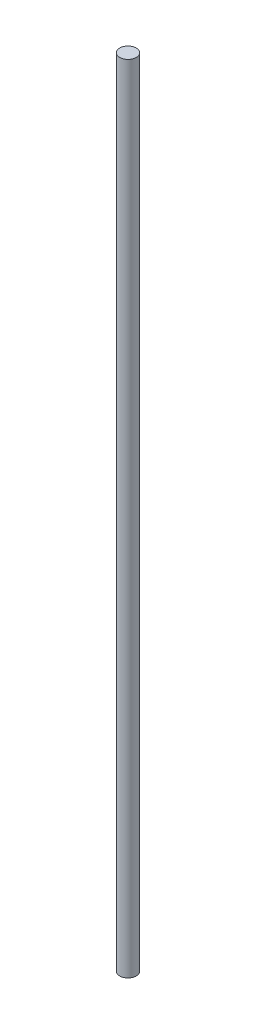
ISO-10303-21;
HEADER;
FILE_DESCRIPTION(('STEP AP214'),'2;1');
FILE_NAME('part.step','',(''),(''),'','','');
FILE_SCHEMA(('AUTOMOTIVE_DESIGN { 1 0 10303 214 1 1 1 1 }'));
ENDSEC;
DATA;
#1=APPLICATION_CONTEXT('core data for automotive mechanical design processes');
#2=APPLICATION_PROTOCOL_DEFINITION('international standard','automotive_design',2000,#1);
#3=PRODUCT_CONTEXT('',#1,'mechanical');
#4=PRODUCT('Part','Part','',(#3));
#5=PRODUCT_RELATED_PRODUCT_CATEGORY('part','',(#4));
#6=PRODUCT_DEFINITION_FORMATION('','',#4);
#7=PRODUCT_DEFINITION_CONTEXT('part definition',#1,'design');
#8=PRODUCT_DEFINITION('design','',#6,#7);
#9=PRODUCT_DEFINITION_SHAPE('','',#8);
#10=(LENGTH_UNIT() NAMED_UNIT(*) SI_UNIT(.MILLI.,.METRE.));
#11=(NAMED_UNIT(*) PLANE_ANGLE_UNIT() SI_UNIT($,.RADIAN.));
#12=(NAMED_UNIT(*) SI_UNIT($,.STERADIAN.) SOLID_ANGLE_UNIT());
#13=UNCERTAINTY_MEASURE_WITH_UNIT(LENGTH_MEASURE(1.E-05),#10,'distance_accuracy_value','');
#14=(GEOMETRIC_REPRESENTATION_CONTEXT(3) GLOBAL_UNCERTAINTY_ASSIGNED_CONTEXT((#13)) GLOBAL_UNIT_ASSIGNED_CONTEXT((#10,
#11,#12)) REPRESENTATION_CONTEXT('',''));
#15=CARTESIAN_POINT('',(0.,0.,0.));
#16=DIRECTION('',(0.,0.,1.));
#17=DIRECTION('',(1.,0.,0.));
#18=AXIS2_PLACEMENT_3D('',#15,#16,#17);
#19=CARTESIAN_POINT('',(-8.5683409021784,386.5,-5.41821557049514));
#20=DIRECTION('',(0.,-1.,0.));
#21=DIRECTION('',(0.,0.,-1.));
#22=AXIS2_PLACEMENT_3D('',#19,#20,#21);
#23=CYLINDRICAL_SURFACE('',#22,4.);
#24=CARTESIAN_POINT('',(-8.5683409021784,386.5,-5.41821557049514));
#25=DIRECTION('',(0.,1.,0.));
#26=DIRECTION('',(0.,0.,1.));
#27=AXIS2_PLACEMENT_3D('',#24,#25,#26);
#28=CIRCLE('',#27,4.);
#29=CARTESIAN_POINT('',(-8.5683409021784,386.5,-1.41821557049514));
#30=VERTEX_POINT('',#29);
#31=EDGE_CURVE('E10',#30,#30,#28,.T.);
#32=ORIENTED_EDGE('',*,*,#31,.F.);
#33=EDGE_LOOP('',(#32));
#34=FACE_BOUND('',#33,.T.);
#35=CARTESIAN_POINT('',(-8.5683409021784,0.,-5.41821557049514));
#36=DIRECTION('',(0.,1.,0.));
#37=DIRECTION('',(0.,0.,1.));
#38=AXIS2_PLACEMENT_3D('',#35,#36,#37);
#39=CIRCLE('',#38,4.);
#40=CARTESIAN_POINT('',(-8.5683409021784,0.,-1.41821557049514));
#41=VERTEX_POINT('',#40);
#42=EDGE_CURVE('E34',#41,#41,#39,.T.);
#43=ORIENTED_EDGE('',*,*,#42,.T.);
#44=EDGE_LOOP('',(#43));
#45=FACE_BOUND('',#44,.T.);
#46=ADVANCED_FACE('F31',(#34,#45),#23,.T.);
#47=CARTESIAN_POINT('',(-8.5683409021784,386.5,-5.41821557049514));
#48=DIRECTION('',(0.,1.,0.));
#49=DIRECTION('',(0.,0.,1.));
#50=AXIS2_PLACEMENT_3D('',#47,#48,#49);
#51=PLANE('',#50);
#52=ORIENTED_EDGE('',*,*,#31,.T.);
#53=EDGE_LOOP('',(#52));
#54=FACE_BOUND('',#53,.T.);
#55=ADVANCED_FACE('F46',(#54),#51,.T.);
#56=CARTESIAN_POINT('',(-8.5683409021784,0.,-5.41821557049514));
#57=DIRECTION('',(0.,1.,0.));
#58=DIRECTION('',(0.,0.,1.));
#59=AXIS2_PLACEMENT_3D('',#56,#57,#58);
#60=PLANE('',#59);
#61=ORIENTED_EDGE('',*,*,#42,.F.);
#62=EDGE_LOOP('',(#61));
#63=FACE_BOUND('',#62,.T.);
#64=ADVANCED_FACE('F44',(#63),#60,.F.);
#65=CLOSED_SHELL('',(#46,#55,#64));
#66=MANIFOLD_SOLID_BREP('B2',#65);
#67=ADVANCED_BREP_SHAPE_REPRESENTATION('',(#18,#66),#14);
#68=SHAPE_DEFINITION_REPRESENTATION(#9,#67);
ENDSEC;
END-ISO-10303-21;
